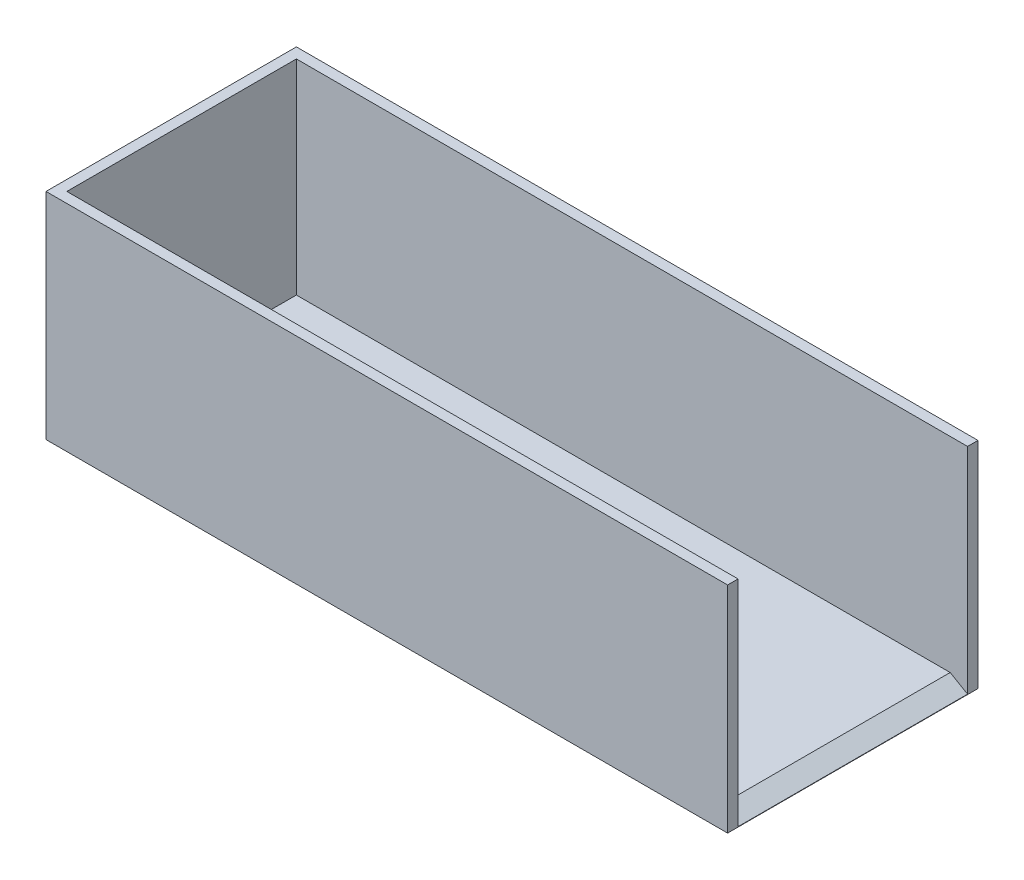
ISO-10303-21;
HEADER;
FILE_DESCRIPTION(('STEP AP214'),'2;1');
FILE_NAME('part.step','',(''),(''),'','','');
FILE_SCHEMA(('AUTOMOTIVE_DESIGN { 1 0 10303 214 1 1 1 1 }'));
ENDSEC;
DATA;
#1=APPLICATION_CONTEXT('core data for automotive mechanical design processes');
#2=APPLICATION_PROTOCOL_DEFINITION('international standard','automotive_design',2000,#1);
#3=PRODUCT_CONTEXT('',#1,'mechanical');
#4=PRODUCT('Part','Part','',(#3));
#5=PRODUCT_RELATED_PRODUCT_CATEGORY('part','',(#4));
#6=PRODUCT_DEFINITION_FORMATION('','',#4);
#7=PRODUCT_DEFINITION_CONTEXT('part definition',#1,'design');
#8=PRODUCT_DEFINITION('design','',#6,#7);
#9=PRODUCT_DEFINITION_SHAPE('','',#8);
#10=(LENGTH_UNIT() NAMED_UNIT(*) SI_UNIT(.MILLI.,.METRE.));
#11=(NAMED_UNIT(*) PLANE_ANGLE_UNIT() SI_UNIT($,.RADIAN.));
#12=(NAMED_UNIT(*) SI_UNIT($,.STERADIAN.) SOLID_ANGLE_UNIT());
#13=UNCERTAINTY_MEASURE_WITH_UNIT(LENGTH_MEASURE(1.E-05),#10,'distance_accuracy_value','');
#14=(GEOMETRIC_REPRESENTATION_CONTEXT(3) GLOBAL_UNCERTAINTY_ASSIGNED_CONTEXT((#13)) GLOBAL_UNIT_ASSIGNED_CONTEXT((#10,
#11,#12)) REPRESENTATION_CONTEXT('',''));
#15=CARTESIAN_POINT('',(0.,0.,0.));
#16=DIRECTION('',(0.,0.,1.));
#17=DIRECTION('',(1.,0.,0.));
#18=AXIS2_PLACEMENT_3D('',#15,#16,#17);
#19=CARTESIAN_POINT('',(-37.1868411625543,3.,-18.9703142417084));
#20=DIRECTION('',(1.,0.,0.));
#21=DIRECTION('',(0.,0.,-1.));
#22=AXIS2_PLACEMENT_3D('',#19,#20,#21);
#23=PLANE('',#22);
#24=DIRECTION('',(0.,0.,1.));
#25=VECTOR('',#24,1.);
#26=CARTESIAN_POINT('',(-37.1868411625543,0.,-18.9703142417084));
#27=LINE('',#26,#25);
#28=CARTESIAN_POINT('',(-37.1868411625543,0.,-18.9703142417084));
#29=VERTEX_POINT('',#28);
#30=CARTESIAN_POINT('',(-37.1868411625543,0.,53.0296857582915));
#31=VERTEX_POINT('',#30);
#32=EDGE_CURVE('E109',#29,#31,#27,.T.);
#33=ORIENTED_EDGE('',*,*,#32,.T.);
#34=DIRECTION('',(0.,-1.,0.));
#35=VECTOR('',#34,1.);
#36=CARTESIAN_POINT('',(-37.1868411625543,3.,53.0296857582915));
#37=LINE('',#36,#35);
#38=CARTESIAN_POINT('',(-37.1868411625543,61.8,53.0296857582915));
#39=VERTEX_POINT('',#38);
#40=EDGE_CURVE('E104',#39,#31,#37,.T.);
#41=ORIENTED_EDGE('',*,*,#40,.F.);
#42=DIRECTION('',(0.,0.,1.));
#43=VECTOR('',#42,1.);
#44=CARTESIAN_POINT('',(-37.1868411625543,61.8,-18.9703142417084));
#45=LINE('',#44,#43);
#46=CARTESIAN_POINT('',(-37.1868411625543,61.8,-18.9703142417084));
#47=VERTEX_POINT('',#46);
#48=EDGE_CURVE('E107',#47,#39,#45,.T.);
#49=ORIENTED_EDGE('',*,*,#48,.F.);
#50=DIRECTION('',(0.,-1.,0.));
#51=VECTOR('',#50,1.);
#52=CARTESIAN_POINT('',(-37.1868411625543,3.,-18.9703142417084));
#53=LINE('',#52,#51);
#54=EDGE_CURVE('E182',#47,#29,#53,.T.);
#55=ORIENTED_EDGE('',*,*,#54,.T.);
#56=EDGE_LOOP('',(#33,#41,#49,#55));
#57=FACE_BOUND('',#56,.T.);
#58=ADVANCED_FACE('F33',(#57),#23,.F.);
#59=CARTESIAN_POINT('',(-37.1868411625543,3.,53.0296857582915));
#60=DIRECTION('',(0.,0.,-1.));
#61=DIRECTION('',(-1.,0.,0.));
#62=AXIS2_PLACEMENT_3D('',#59,#60,#61);
#63=PLANE('',#62);
#64=DIRECTION('',(1.,0.,0.));
#65=VECTOR('',#64,1.);
#66=CARTESIAN_POINT('',(-37.1868411625543,0.,53.0296857582915));
#67=LINE('',#66,#65);
#68=CARTESIAN_POINT('',(158.813158837446,0.,53.0296857582915));
#69=VERTEX_POINT('',#68);
#70=EDGE_CURVE('E167',#31,#69,#67,.T.);
#71=ORIENTED_EDGE('',*,*,#70,.T.);
#72=DIRECTION('',(0.,-1.,0.));
#73=VECTOR('',#72,1.);
#74=CARTESIAN_POINT('',(158.813158837446,3.,53.0296857582915));
#75=LINE('',#74,#73);
#76=CARTESIAN_POINT('',(158.813158837446,61.8,53.0296857582915));
#77=VERTEX_POINT('',#76);
#78=EDGE_CURVE('E113',#77,#69,#75,.T.);
#79=ORIENTED_EDGE('',*,*,#78,.F.);
#80=DIRECTION('',(1.,0.,0.));
#81=VECTOR('',#80,1.);
#82=CARTESIAN_POINT('',(-37.1868411625543,61.8,53.0296857582915));
#83=LINE('',#82,#81);
#84=EDGE_CURVE('E116',#39,#77,#83,.T.);
#85=ORIENTED_EDGE('',*,*,#84,.F.);
#86=ORIENTED_EDGE('',*,*,#40,.T.);
#87=EDGE_LOOP('',(#71,#79,#85,#86));
#88=FACE_BOUND('',#87,.T.);
#89=ADVANCED_FACE('F117',(#88),#63,.F.);
#90=CARTESIAN_POINT('',(158.813158837446,3.,-18.9703142417084));
#91=DIRECTION('',(1.,0.,0.));
#92=DIRECTION('',(0.,0.,-1.));
#93=AXIS2_PLACEMENT_3D('',#90,#91,#92);
#94=PLANE('',#93);
#95=DIRECTION('',(0.,0.,1.));
#96=VECTOR('',#95,1.);
#97=CARTESIAN_POINT('',(158.813158837446,0.113248654051876,-18.9703142417084));
#98=LINE('',#97,#96);
#99=CARTESIAN_POINT('',(158.813158837446,0.113248654051878,-15.9703142417085));
#100=VERTEX_POINT('',#99);
#101=CARTESIAN_POINT('',(158.813158837446,0.113248654051876,50.0296857582915));
#102=VERTEX_POINT('',#101);
#103=EDGE_CURVE('E112',#100,#102,#98,.T.);
#104=ORIENTED_EDGE('',*,*,#103,.T.);
#105=DIRECTION('',(0.,-1.,0.));
#106=VECTOR('',#105,1.);
#107=CARTESIAN_POINT('',(158.813158837446,61.8,50.0296857582915));
#108=LINE('',#107,#106);
#109=CARTESIAN_POINT('',(158.813158837446,61.8,50.0296857582915));
#110=VERTEX_POINT('',#109);
#111=EDGE_CURVE('E163',#110,#102,#108,.T.);
#112=ORIENTED_EDGE('',*,*,#111,.F.);
#113=DIRECTION('',(0.,0.,-1.));
#114=VECTOR('',#113,1.);
#115=CARTESIAN_POINT('',(158.813158837446,61.8,53.0296857582915));
#116=LINE('',#115,#114);
#117=EDGE_CURVE('E120',#77,#110,#116,.T.);
#118=ORIENTED_EDGE('',*,*,#117,.F.);
#119=ORIENTED_EDGE('',*,*,#78,.T.);
#120=DIRECTION('',(0.,0.,1.));
#121=VECTOR('',#120,1.);
#122=CARTESIAN_POINT('',(158.813158837446,0.,-18.9703142417084));
#123=LINE('',#122,#121);
#124=CARTESIAN_POINT('',(158.813158837446,0.,-18.9703142417084));
#125=VERTEX_POINT('',#124);
#126=EDGE_CURVE('E176',#125,#69,#123,.T.);
#127=ORIENTED_EDGE('',*,*,#126,.F.);
#128=DIRECTION('',(0.,-1.,0.));
#129=VECTOR('',#128,1.);
#130=CARTESIAN_POINT('',(158.813158837446,3.,-18.9703142417084));
#131=LINE('',#130,#129);
#132=CARTESIAN_POINT('',(158.813158837446,61.8,-18.9703142417084));
#133=VERTEX_POINT('',#132);
#134=EDGE_CURVE('E184',#133,#125,#131,.T.);
#135=ORIENTED_EDGE('',*,*,#134,.F.);
#136=DIRECTION('',(0.,0.,-1.));
#137=VECTOR('',#136,1.);
#138=CARTESIAN_POINT('',(158.813158837446,61.8,-18.9703142417084));
#139=LINE('',#138,#137);
#140=CARTESIAN_POINT('',(158.813158837446,61.8,-15.9703142417085));
#141=VERTEX_POINT('',#140);
#142=EDGE_CURVE('E139',#141,#133,#139,.T.);
#143=ORIENTED_EDGE('',*,*,#142,.F.);
#144=DIRECTION('',(0.,-1.,0.));
#145=VECTOR('',#144,1.);
#146=CARTESIAN_POINT('',(158.813158837446,61.8,-15.9703142417085));
#147=LINE('',#146,#145);
#148=EDGE_CURVE('E142',#141,#100,#147,.T.);
#149=ORIENTED_EDGE('',*,*,#148,.T.);
#150=EDGE_LOOP('',(#104,#112,#118,#119,#127,#135,#143,#149));
#151=FACE_BOUND('',#150,.T.);
#152=ADVANCED_FACE('F187',(#151),#94,.T.);
#153=CARTESIAN_POINT('',(-37.1868411625543,3.,-18.9703142417084));
#154=DIRECTION('',(0.,0.,-1.));
#155=DIRECTION('',(-1.,0.,0.));
#156=AXIS2_PLACEMENT_3D('',#153,#154,#155);
#157=PLANE('',#156);
#158=DIRECTION('',(1.,0.,0.));
#159=VECTOR('',#158,1.);
#160=CARTESIAN_POINT('',(-37.1868411625543,0.,-18.9703142417084));
#161=LINE('',#160,#159);
#162=EDGE_CURVE('E179',#29,#125,#161,.T.);
#163=ORIENTED_EDGE('',*,*,#162,.F.);
#164=ORIENTED_EDGE('',*,*,#54,.F.);
#165=DIRECTION('',(-1.,0.,0.));
#166=VECTOR('',#165,1.);
#167=CARTESIAN_POINT('',(-37.1868411625543,61.8,-18.9703142417084));
#168=LINE('',#167,#166);
#169=EDGE_CURVE('E126',#133,#47,#168,.T.);
#170=ORIENTED_EDGE('',*,*,#169,.F.);
#171=ORIENTED_EDGE('',*,*,#134,.T.);
#172=EDGE_LOOP('',(#163,#164,#170,#171));
#173=FACE_BOUND('',#172,.T.);
#174=ADVANCED_FACE('F192',(#173),#157,.T.);
#175=CARTESIAN_POINT('',(0.,3.,0.));
#176=DIRECTION('',(0.,1.,0.));
#177=DIRECTION('',(0.,0.,1.));
#178=AXIS2_PLACEMENT_3D('',#175,#176,#177);
#179=PLANE('',#178);
#180=DIRECTION('',(-1.,0.,0.));
#181=VECTOR('',#180,1.);
#182=CARTESIAN_POINT('',(-34.1868411625543,3.,50.0296857582915));
#183=LINE('',#182,#181);
#184=CARTESIAN_POINT('',(153.813158837446,3.,50.0296857582915));
#185=VERTEX_POINT('',#184);
#186=CARTESIAN_POINT('',(-34.1868411625543,3.,50.0296857582915));
#187=VERTEX_POINT('',#186);
#188=EDGE_CURVE('E145',#185,#187,#183,.T.);
#189=ORIENTED_EDGE('',*,*,#188,.F.);
#190=DIRECTION('',(0.,0.,-1.));
#191=VECTOR('',#190,1.);
#192=CARTESIAN_POINT('',(153.813158837446,3.,0.));
#193=LINE('',#192,#191);
#194=CARTESIAN_POINT('',(153.813158837446,3.,-15.9703142417085));
#195=VERTEX_POINT('',#194);
#196=EDGE_CURVE('E54',#185,#195,#193,.T.);
#197=ORIENTED_EDGE('',*,*,#196,.T.);
#198=DIRECTION('',(1.,0.,0.));
#199=VECTOR('',#198,1.);
#200=CARTESIAN_POINT('',(158.813158837446,3.,-15.9703142417085));
#201=LINE('',#200,#199);
#202=CARTESIAN_POINT('',(-34.1868411625543,3.,-15.9703142417084));
#203=VERTEX_POINT('',#202);
#204=EDGE_CURVE('E127',#203,#195,#201,.T.);
#205=ORIENTED_EDGE('',*,*,#204,.F.);
#206=DIRECTION('',(0.,0.,-1.));
#207=VECTOR('',#206,1.);
#208=CARTESIAN_POINT('',(-34.1868411625543,3.,-15.9703142417084));
#209=LINE('',#208,#207);
#210=EDGE_CURVE('E129',#187,#203,#209,.T.);
#211=ORIENTED_EDGE('',*,*,#210,.F.);
#212=EDGE_LOOP('',(#189,#197,#205,#211));
#213=FACE_BOUND('',#212,.T.);
#214=ADVANCED_FACE('F217',(#213),#179,.T.);
#215=CARTESIAN_POINT('',(0.,0.,0.));
#216=DIRECTION('',(0.,1.,0.));
#217=DIRECTION('',(0.,0.,1.));
#218=AXIS2_PLACEMENT_3D('',#215,#216,#217);
#219=PLANE('',#218);
#220=ORIENTED_EDGE('',*,*,#32,.F.);
#221=ORIENTED_EDGE('',*,*,#162,.T.);
#222=ORIENTED_EDGE('',*,*,#126,.T.);
#223=ORIENTED_EDGE('',*,*,#70,.F.);
#224=EDGE_LOOP('',(#220,#221,#222,#223));
#225=FACE_BOUND('',#224,.T.);
#226=ADVANCED_FACE('F189',(#225),#219,.F.);
#227=CARTESIAN_POINT('',(-34.1868411625543,61.8,50.0296857582915));
#228=DIRECTION('',(0.,0.,1.));
#229=DIRECTION('',(1.,0.,0.));
#230=AXIS2_PLACEMENT_3D('',#227,#228,#229);
#231=PLANE('',#230);
#232=ORIENTED_EDGE('',*,*,#111,.T.);
#233=DIRECTION('',(0.86602540378444,-0.499999999999997,0.));
#234=VECTOR('',#233,1.);
#235=CARTESIAN_POINT('',(-12.6479880338173,99.1063879557367,50.0296857582915));
#236=LINE('',#235,#234);
#237=EDGE_CURVE('E41',#102,#185,#236,.F.);
#238=ORIENTED_EDGE('',*,*,#237,.T.);
#239=ORIENTED_EDGE('',*,*,#188,.T.);
#240=DIRECTION('',(0.,-1.,0.));
#241=VECTOR('',#240,1.);
#242=CARTESIAN_POINT('',(-34.1868411625543,61.8,50.0296857582915));
#243=LINE('',#242,#241);
#244=CARTESIAN_POINT('',(-34.1868411625543,61.8,50.0296857582915));
#245=VERTEX_POINT('',#244);
#246=EDGE_CURVE('E164',#245,#187,#243,.T.);
#247=ORIENTED_EDGE('',*,*,#246,.F.);
#248=DIRECTION('',(-1.,0.,0.));
#249=VECTOR('',#248,1.);
#250=CARTESIAN_POINT('',(-34.1868411625543,61.8,50.0296857582915));
#251=LINE('',#250,#249);
#252=EDGE_CURVE('E133',#110,#245,#251,.T.);
#253=ORIENTED_EDGE('',*,*,#252,.F.);
#254=EDGE_LOOP('',(#232,#238,#239,#247,#253));
#255=FACE_BOUND('',#254,.T.);
#256=ADVANCED_FACE('F220',(#255),#231,.F.);
#257=CARTESIAN_POINT('',(-34.1868411625543,61.8,-15.9703142417084));
#258=DIRECTION('',(-1.,0.,0.));
#259=DIRECTION('',(0.,0.,1.));
#260=AXIS2_PLACEMENT_3D('',#257,#258,#259);
#261=PLANE('',#260);
#262=ORIENTED_EDGE('',*,*,#210,.T.);
#263=DIRECTION('',(0.,-1.,0.));
#264=VECTOR('',#263,1.);
#265=CARTESIAN_POINT('',(-34.1868411625543,61.8,-15.9703142417084));
#266=LINE('',#265,#264);
#267=CARTESIAN_POINT('',(-34.1868411625543,61.8,-15.9703142417084));
#268=VERTEX_POINT('',#267);
#269=EDGE_CURVE('E148',#268,#203,#266,.T.);
#270=ORIENTED_EDGE('',*,*,#269,.F.);
#271=DIRECTION('',(0.,0.,-1.));
#272=VECTOR('',#271,1.);
#273=CARTESIAN_POINT('',(-34.1868411625543,61.8,-15.9703142417084));
#274=LINE('',#273,#272);
#275=EDGE_CURVE('E135',#245,#268,#274,.T.);
#276=ORIENTED_EDGE('',*,*,#275,.F.);
#277=ORIENTED_EDGE('',*,*,#246,.T.);
#278=EDGE_LOOP('',(#262,#270,#276,#277));
#279=FACE_BOUND('',#278,.T.);
#280=ADVANCED_FACE('F225',(#279),#261,.F.);
#281=CARTESIAN_POINT('',(158.813158837446,61.8,-15.9703142417085));
#282=DIRECTION('',(0.,0.,-1.));
#283=DIRECTION('',(-1.,0.,0.));
#284=AXIS2_PLACEMENT_3D('',#281,#282,#283);
#285=PLANE('',#284);
#286=ORIENTED_EDGE('',*,*,#204,.T.);
#287=DIRECTION('',(-0.86602540378444,0.499999999999997,0.));
#288=VECTOR('',#287,1.);
#289=CARTESIAN_POINT('',(132.102011966183,15.5349364905387,-15.9703142417085));
#290=LINE('',#289,#288);
#291=EDGE_CURVE('E11',#195,#100,#290,.F.);
#292=ORIENTED_EDGE('',*,*,#291,.T.);
#293=ORIENTED_EDGE('',*,*,#148,.F.);
#294=DIRECTION('',(1.,0.,0.));
#295=VECTOR('',#294,1.);
#296=CARTESIAN_POINT('',(158.813158837446,61.8,-15.9703142417085));
#297=LINE('',#296,#295);
#298=EDGE_CURVE('E137',#268,#141,#297,.T.);
#299=ORIENTED_EDGE('',*,*,#298,.F.);
#300=ORIENTED_EDGE('',*,*,#269,.T.);
#301=EDGE_LOOP('',(#286,#292,#293,#299,#300));
#302=FACE_BOUND('',#301,.T.);
#303=ADVANCED_FACE('F198',(#302),#285,.F.);
#304=CARTESIAN_POINT('',(0.,61.8,0.));
#305=DIRECTION('',(0.,1.,0.));
#306=DIRECTION('',(0.,0.,1.));
#307=AXIS2_PLACEMENT_3D('',#304,#305,#306);
#308=PLANE('',#307);
#309=ORIENTED_EDGE('',*,*,#48,.T.);
#310=ORIENTED_EDGE('',*,*,#84,.T.);
#311=ORIENTED_EDGE('',*,*,#117,.T.);
#312=ORIENTED_EDGE('',*,*,#252,.T.);
#313=ORIENTED_EDGE('',*,*,#275,.T.);
#314=ORIENTED_EDGE('',*,*,#298,.T.);
#315=ORIENTED_EDGE('',*,*,#142,.T.);
#316=ORIENTED_EDGE('',*,*,#169,.T.);
#317=EDGE_LOOP('',(#309,#310,#311,#312,#313,#314,#315,#316));
#318=FACE_BOUND('',#317,.T.);
#319=ADVANCED_FACE('F123',(#318),#308,.T.);
#320=CARTESIAN_POINT('',(158.813158837446,0.113248654051876,-18.9703142417084));
#321=DIRECTION('',(-0.499999999999997,-0.86602540378444,0.));
#322=DIRECTION('',(0.,0.,1.));
#323=AXIS2_PLACEMENT_3D('',#320,#321,#322);
#324=PLANE('',#323);
#325=ORIENTED_EDGE('',*,*,#291,.F.);
#326=ORIENTED_EDGE('',*,*,#196,.F.);
#327=ORIENTED_EDGE('',*,*,#237,.F.);
#328=ORIENTED_EDGE('',*,*,#103,.F.);
#329=EDGE_LOOP('',(#325,#326,#327,#328));
#330=FACE_BOUND('',#329,.T.);
#331=ADVANCED_FACE('F35',(#330),#324,.F.);
#332=CLOSED_SHELL('',(#58,#89,#152,#174,#214,#226,#256,#280,#303,#319,#331));
#333=MANIFOLD_SOLID_BREP('B2',#332);
#334=ADVANCED_BREP_SHAPE_REPRESENTATION('',(#18,#333),#14);
#335=SHAPE_DEFINITION_REPRESENTATION(#9,#334);
ENDSEC;
END-ISO-10303-21;
